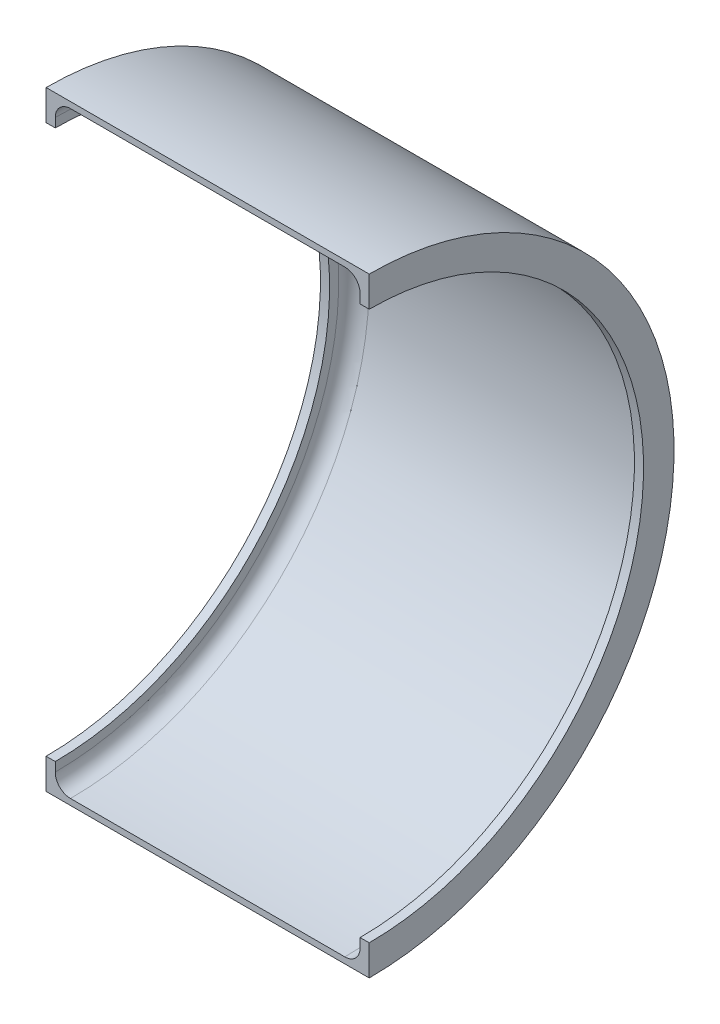
ISO-10303-21;
HEADER;
FILE_DESCRIPTION(('STEP AP214'),'2;1');
FILE_NAME('part.step','',(''),(''),'','','');
FILE_SCHEMA(('AUTOMOTIVE_DESIGN { 1 0 10303 214 1 1 1 1 }'));
ENDSEC;
DATA;
#1=APPLICATION_CONTEXT('core data for automotive mechanical design processes');
#2=APPLICATION_PROTOCOL_DEFINITION('international standard','automotive_design',2000,#1);
#3=PRODUCT_CONTEXT('',#1,'mechanical');
#4=PRODUCT('Part','Part','',(#3));
#5=PRODUCT_RELATED_PRODUCT_CATEGORY('part','',(#4));
#6=PRODUCT_DEFINITION_FORMATION('','',#4);
#7=PRODUCT_DEFINITION_CONTEXT('part definition',#1,'design');
#8=PRODUCT_DEFINITION('design','',#6,#7);
#9=PRODUCT_DEFINITION_SHAPE('','',#8);
#10=(LENGTH_UNIT() NAMED_UNIT(*) SI_UNIT(.MILLI.,.METRE.));
#11=(NAMED_UNIT(*) PLANE_ANGLE_UNIT() SI_UNIT($,.RADIAN.));
#12=(NAMED_UNIT(*) SI_UNIT($,.STERADIAN.) SOLID_ANGLE_UNIT());
#13=UNCERTAINTY_MEASURE_WITH_UNIT(LENGTH_MEASURE(1.E-05),#10,'distance_accuracy_value','');
#14=(GEOMETRIC_REPRESENTATION_CONTEXT(3) GLOBAL_UNCERTAINTY_ASSIGNED_CONTEXT((#13)) GLOBAL_UNIT_ASSIGNED_CONTEXT((#10,
#11,#12)) REPRESENTATION_CONTEXT('',''));
#15=CARTESIAN_POINT('',(0.,0.,0.));
#16=DIRECTION('',(0.,0.,1.));
#17=DIRECTION('',(1.,0.,0.));
#18=AXIS2_PLACEMENT_3D('',#15,#16,#17);
#19=CARTESIAN_POINT('',(-50.,0.,0.));
#20=DIRECTION('',(1.,0.,0.));
#21=DIRECTION('',(0.,0.,-1.));
#22=AXIS2_PLACEMENT_3D('',#19,#20,#21);
#23=CYLINDRICAL_SURFACE('',#22,100.);
#24=DIRECTION('',(-1.,0.,0.));
#25=VECTOR('',#24,1.);
#26=CARTESIAN_POINT('',(-50.,-100.,6.98296267768627E-13));
#27=LINE('',#26,#25);
#28=CARTESIAN_POINT('',(53.,-100.,6.98296267768627E-13));
#29=VERTEX_POINT('',#28);
#30=CARTESIAN_POINT('',(-53.,-100.,6.98296267768627E-13));
#31=VERTEX_POINT('',#30);
#32=EDGE_CURVE('E170',#29,#31,#27,.T.);
#33=ORIENTED_EDGE('',*,*,#32,.T.);
#34=CARTESIAN_POINT('',(-53.,0.,0.));
#35=DIRECTION('',(1.,0.,0.));
#36=DIRECTION('',(0.,0.,-1.));
#37=AXIS2_PLACEMENT_3D('',#34,#35,#36);
#38=CIRCLE('',#37,100.);
#39=CARTESIAN_POINT('',(-53.,100.,0.));
#40=VERTEX_POINT('',#39);
#41=EDGE_CURVE('E141',#31,#40,#38,.T.);
#42=ORIENTED_EDGE('',*,*,#41,.T.);
#43=DIRECTION('',(-1.,0.,0.));
#44=VECTOR('',#43,1.);
#45=CARTESIAN_POINT('',(-50.,100.,0.));
#46=LINE('',#45,#44);
#47=CARTESIAN_POINT('',(53.,100.,0.));
#48=VERTEX_POINT('',#47);
#49=EDGE_CURVE('E166',#48,#40,#46,.T.);
#50=ORIENTED_EDGE('',*,*,#49,.F.);
#51=CARTESIAN_POINT('',(53.,0.,0.));
#52=DIRECTION('',(1.,0.,0.));
#53=DIRECTION('',(0.,0.,-1.));
#54=AXIS2_PLACEMENT_3D('',#51,#52,#53);
#55=CIRCLE('',#54,100.);
#56=EDGE_CURVE('E158',#29,#48,#55,.T.);
#57=ORIENTED_EDGE('',*,*,#56,.F.);
#58=EDGE_LOOP('',(#33,#42,#50,#57));
#59=FACE_BOUND('',#58,.T.);
#60=ADVANCED_FACE('F39',(#59),#23,.T.);
#61=CARTESIAN_POINT('',(-50.,0.,0.));
#62=DIRECTION('',(1.,0.,0.));
#63=DIRECTION('',(0.,0.,-1.));
#64=AXIS2_PLACEMENT_3D('',#61,#62,#63);
#65=CYLINDRICAL_SURFACE('',#64,98.);
#66=DIRECTION('',(1.,0.,0.));
#67=VECTOR('',#66,1.);
#68=CARTESIAN_POINT('',(-50.,98.,0.));
#69=LINE('',#68,#67);
#70=CARTESIAN_POINT('',(-45.,98.,0.));
#71=VERTEX_POINT('',#70);
#72=CARTESIAN_POINT('',(45.,98.,0.));
#73=VERTEX_POINT('',#72);
#74=EDGE_CURVE('E168',#71,#73,#69,.T.);
#75=ORIENTED_EDGE('',*,*,#74,.F.);
#76=CARTESIAN_POINT('',(-45.,0.,0.));
#77=DIRECTION('',(1.,0.,0.));
#78=DIRECTION('',(0.,0.,-1.));
#79=AXIS2_PLACEMENT_3D('',#76,#77,#78);
#80=CIRCLE('',#79,98.);
#81=CARTESIAN_POINT('',(-45.,-98.,6.84330342413254E-13));
#82=VERTEX_POINT('',#81);
#83=EDGE_CURVE('E60',#71,#82,#80,.F.);
#84=ORIENTED_EDGE('',*,*,#83,.T.);
#85=DIRECTION('',(1.,0.,0.));
#86=VECTOR('',#85,1.);
#87=CARTESIAN_POINT('',(-50.,-98.,6.84330342413254E-13));
#88=LINE('',#87,#86);
#89=CARTESIAN_POINT('',(45.,-98.,6.84330342413254E-13));
#90=VERTEX_POINT('',#89);
#91=EDGE_CURVE('E172',#82,#90,#88,.T.);
#92=ORIENTED_EDGE('',*,*,#91,.T.);
#93=CARTESIAN_POINT('',(45.,0.,0.));
#94=DIRECTION('',(-1.,0.,0.));
#95=DIRECTION('',(0.,0.,1.));
#96=AXIS2_PLACEMENT_3D('',#93,#94,#95);
#97=CIRCLE('',#96,98.);
#98=EDGE_CURVE('E174',#90,#73,#97,.F.);
#99=ORIENTED_EDGE('',*,*,#98,.T.);
#100=EDGE_LOOP('',(#75,#84,#92,#99));
#101=FACE_BOUND('',#100,.T.);
#102=ADVANCED_FACE('F196',(#101),#65,.F.);
#103=CARTESIAN_POINT('',(0.,0.,0.));
#104=DIRECTION('',(0.,0.,-1.));
#105=DIRECTION('',(1.,0.,0.));
#106=AXIS2_PLACEMENT_3D('',#103,#104,#105);
#107=PLANE('',#106);
#108=ORIENTED_EDGE('',*,*,#32,.F.);
#109=DIRECTION('',(0.,-1.,0.));
#110=VECTOR('',#109,1.);
#111=CARTESIAN_POINT('',(53.,-100.,6.98296267768627E-13));
#112=LINE('',#111,#110);
#113=CARTESIAN_POINT('',(53.,-90.,6.28466640991764E-13));
#114=VERTEX_POINT('',#113);
#115=EDGE_CURVE('E155',#114,#29,#112,.T.);
#116=ORIENTED_EDGE('',*,*,#115,.F.);
#117=DIRECTION('',(1.,0.,0.));
#118=VECTOR('',#117,1.);
#119=CARTESIAN_POINT('',(50.,-90.,6.28466640991764E-13));
#120=LINE('',#119,#118);
#121=CARTESIAN_POINT('',(50.,-90.,6.28466640991764E-13));
#122=VERTEX_POINT('',#121);
#123=EDGE_CURVE('E152',#122,#114,#120,.T.);
#124=ORIENTED_EDGE('',*,*,#123,.F.);
#125=DIRECTION('',(0.,1.,0.));
#126=VECTOR('',#125,1.);
#127=CARTESIAN_POINT('',(50.,-100.,6.98296267768627E-13));
#128=LINE('',#127,#126);
#129=CARTESIAN_POINT('',(50.,-93.,6.49415529024823E-13));
#130=VERTEX_POINT('',#129);
#131=EDGE_CURVE('E150',#130,#122,#128,.T.);
#132=ORIENTED_EDGE('',*,*,#131,.F.);
#133=CARTESIAN_POINT('',(45.,-93.,6.49415529024823E-13));
#134=DIRECTION('',(0.,0.,-1.));
#135=DIRECTION('',(0.,1.,0.));
#136=AXIS2_PLACEMENT_3D('',#133,#134,#135);
#137=CIRCLE('',#136,5.);
#138=EDGE_CURVE('E181',#130,#90,#137,.T.);
#139=ORIENTED_EDGE('',*,*,#138,.T.);
#140=ORIENTED_EDGE('',*,*,#91,.F.);
#141=CARTESIAN_POINT('',(-45.,-93.,6.49415529024823E-13));
#142=DIRECTION('',(0.,0.,-1.));
#143=DIRECTION('',(0.,1.,0.));
#144=AXIS2_PLACEMENT_3D('',#141,#142,#143);
#145=CIRCLE('',#144,5.);
#146=CARTESIAN_POINT('',(-50.,-93.,6.49415529024823E-13));
#147=VERTEX_POINT('',#146);
#148=EDGE_CURVE('E11',#82,#147,#145,.T.);
#149=ORIENTED_EDGE('',*,*,#148,.T.);
#150=DIRECTION('',(0.,1.,0.));
#151=VECTOR('',#150,1.);
#152=CARTESIAN_POINT('',(-50.,-100.,6.98296267768627E-13));
#153=LINE('',#152,#151);
#154=CARTESIAN_POINT('',(-50.,-90.,6.28466640991764E-13));
#155=VERTEX_POINT('',#154);
#156=EDGE_CURVE('E198',#147,#155,#153,.T.);
#157=ORIENTED_EDGE('',*,*,#156,.T.);
#158=DIRECTION('',(-1.,0.,0.));
#159=VECTOR('',#158,1.);
#160=CARTESIAN_POINT('',(-50.,-90.,6.28466640991764E-13));
#161=LINE('',#160,#159);
#162=CARTESIAN_POINT('',(-53.,-90.,6.28466640991764E-13));
#163=VERTEX_POINT('',#162);
#164=EDGE_CURVE('E135',#155,#163,#161,.T.);
#165=ORIENTED_EDGE('',*,*,#164,.T.);
#166=DIRECTION('',(0.,-1.,0.));
#167=VECTOR('',#166,1.);
#168=CARTESIAN_POINT('',(-53.,-100.,6.98296267768627E-13));
#169=LINE('',#168,#167);
#170=EDGE_CURVE('E200',#163,#31,#169,.T.);
#171=ORIENTED_EDGE('',*,*,#170,.T.);
#172=EDGE_LOOP('',(#108,#116,#124,#132,#139,#140,#149,#157,#165,#171));
#173=FACE_BOUND('',#172,.T.);
#174=ADVANCED_FACE('F189',(#173),#107,.F.);
#175=CARTESIAN_POINT('',(0.,0.,0.));
#176=DIRECTION('',(0.,0.,1.));
#177=DIRECTION('',(1.,0.,0.));
#178=AXIS2_PLACEMENT_3D('',#175,#176,#177);
#179=PLANE('',#178);
#180=DIRECTION('',(0.,-1.,0.));
#181=VECTOR('',#180,1.);
#182=CARTESIAN_POINT('',(-50.,100.,0.));
#183=LINE('',#182,#181);
#184=CARTESIAN_POINT('',(-50.,93.,0.));
#185=VERTEX_POINT('',#184);
#186=CARTESIAN_POINT('',(-50.,90.,0.));
#187=VERTEX_POINT('',#186);
#188=EDGE_CURVE('E114',#185,#187,#183,.T.);
#189=ORIENTED_EDGE('',*,*,#188,.F.);
#190=CARTESIAN_POINT('',(-45.,93.,0.));
#191=DIRECTION('',(0.,0.,1.));
#192=DIRECTION('',(1.,0.,0.));
#193=AXIS2_PLACEMENT_3D('',#190,#191,#192);
#194=CIRCLE('',#193,5.);
#195=EDGE_CURVE('E47',#185,#71,#194,.F.);
#196=ORIENTED_EDGE('',*,*,#195,.T.);
#197=ORIENTED_EDGE('',*,*,#74,.T.);
#198=CARTESIAN_POINT('',(45.,93.,0.));
#199=DIRECTION('',(0.,0.,1.));
#200=DIRECTION('',(1.,0.,0.));
#201=AXIS2_PLACEMENT_3D('',#198,#199,#200);
#202=CIRCLE('',#201,5.);
#203=CARTESIAN_POINT('',(50.,93.,0.));
#204=VERTEX_POINT('',#203);
#205=EDGE_CURVE('E179',#73,#204,#202,.F.);
#206=ORIENTED_EDGE('',*,*,#205,.T.);
#207=DIRECTION('',(0.,-1.,0.));
#208=VECTOR('',#207,1.);
#209=CARTESIAN_POINT('',(50.,100.,0.));
#210=LINE('',#209,#208);
#211=CARTESIAN_POINT('',(50.,90.,0.));
#212=VERTEX_POINT('',#211);
#213=EDGE_CURVE('E136',#204,#212,#210,.T.);
#214=ORIENTED_EDGE('',*,*,#213,.T.);
#215=DIRECTION('',(1.,0.,0.));
#216=VECTOR('',#215,1.);
#217=CARTESIAN_POINT('',(50.,90.,0.));
#218=LINE('',#217,#216);
#219=CARTESIAN_POINT('',(53.,90.,0.));
#220=VERTEX_POINT('',#219);
#221=EDGE_CURVE('E139',#212,#220,#218,.T.);
#222=ORIENTED_EDGE('',*,*,#221,.T.);
#223=DIRECTION('',(0.,1.,0.));
#224=VECTOR('',#223,1.);
#225=CARTESIAN_POINT('',(53.,100.,0.));
#226=LINE('',#225,#224);
#227=EDGE_CURVE('E147',#220,#48,#226,.T.);
#228=ORIENTED_EDGE('',*,*,#227,.T.);
#229=ORIENTED_EDGE('',*,*,#49,.T.);
#230=DIRECTION('',(0.,1.,0.));
#231=VECTOR('',#230,1.);
#232=CARTESIAN_POINT('',(-53.,100.,0.));
#233=LINE('',#232,#231);
#234=CARTESIAN_POINT('',(-53.,90.,0.));
#235=VERTEX_POINT('',#234);
#236=EDGE_CURVE('E127',#235,#40,#233,.T.);
#237=ORIENTED_EDGE('',*,*,#236,.F.);
#238=DIRECTION('',(-1.,0.,0.));
#239=VECTOR('',#238,1.);
#240=CARTESIAN_POINT('',(-50.,90.,0.));
#241=LINE('',#240,#239);
#242=EDGE_CURVE('E122',#187,#235,#241,.T.);
#243=ORIENTED_EDGE('',*,*,#242,.F.);
#244=EDGE_LOOP('',(#189,#196,#197,#206,#214,#222,#228,#229,#237,#243));
#245=FACE_BOUND('',#244,.T.);
#246=ADVANCED_FACE('F125',(#245),#179,.T.);
#247=CARTESIAN_POINT('',(50.,-100.,6.98296267768627E-13));
#248=DIRECTION('',(-1.,0.,0.));
#249=DIRECTION('',(0.,0.,1.));
#250=AXIS2_PLACEMENT_3D('',#247,#248,#249);
#251=PLANE('',#250);
#252=ORIENTED_EDGE('',*,*,#213,.F.);
#253=CARTESIAN_POINT('',(50.,0.,0.));
#254=DIRECTION('',(-1.,0.,0.));
#255=DIRECTION('',(0.,0.,1.));
#256=AXIS2_PLACEMENT_3D('',#253,#254,#255);
#257=CIRCLE('',#256,93.);
#258=EDGE_CURVE('E177',#204,#130,#257,.T.);
#259=ORIENTED_EDGE('',*,*,#258,.T.);
#260=ORIENTED_EDGE('',*,*,#131,.T.);
#261=CARTESIAN_POINT('',(50.,0.,0.));
#262=DIRECTION('',(1.,0.,0.));
#263=DIRECTION('',(0.,0.,-1.));
#264=AXIS2_PLACEMENT_3D('',#261,#262,#263);
#265=CIRCLE('',#264,90.);
#266=EDGE_CURVE('E163',#122,#212,#265,.T.);
#267=ORIENTED_EDGE('',*,*,#266,.T.);
#268=EDGE_LOOP('',(#252,#259,#260,#267));
#269=FACE_BOUND('',#268,.T.);
#270=ADVANCED_FACE('F221',(#269),#251,.T.);
#271=CARTESIAN_POINT('',(-50.,0.,0.));
#272=DIRECTION('',(1.,0.,0.));
#273=DIRECTION('',(0.,0.,-1.));
#274=AXIS2_PLACEMENT_3D('',#271,#272,#273);
#275=CYLINDRICAL_SURFACE('',#274,90.);
#276=CARTESIAN_POINT('',(53.,0.,0.));
#277=DIRECTION('',(1.,0.,0.));
#278=DIRECTION('',(0.,0.,-1.));
#279=AXIS2_PLACEMENT_3D('',#276,#277,#278);
#280=CIRCLE('',#279,90.);
#281=EDGE_CURVE('E161',#114,#220,#280,.T.);
#282=ORIENTED_EDGE('',*,*,#281,.T.);
#283=ORIENTED_EDGE('',*,*,#221,.F.);
#284=ORIENTED_EDGE('',*,*,#266,.F.);
#285=ORIENTED_EDGE('',*,*,#123,.T.);
#286=EDGE_LOOP('',(#282,#283,#284,#285));
#287=FACE_BOUND('',#286,.T.);
#288=ADVANCED_FACE('F218',(#287),#275,.F.);
#289=CARTESIAN_POINT('',(53.,-100.,6.98296267768627E-13));
#290=DIRECTION('',(1.,0.,0.));
#291=DIRECTION('',(0.,0.,-1.));
#292=AXIS2_PLACEMENT_3D('',#289,#290,#291);
#293=PLANE('',#292);
#294=ORIENTED_EDGE('',*,*,#56,.T.);
#295=ORIENTED_EDGE('',*,*,#227,.F.);
#296=ORIENTED_EDGE('',*,*,#281,.F.);
#297=ORIENTED_EDGE('',*,*,#115,.T.);
#298=EDGE_LOOP('',(#294,#295,#296,#297));
#299=FACE_BOUND('',#298,.T.);
#300=ADVANCED_FACE('F214',(#299),#293,.T.);
#301=CARTESIAN_POINT('',(45.,0.,0.));
#302=DIRECTION('',(-1.,0.,0.));
#303=DIRECTION('',(0.,0.,1.));
#304=AXIS2_PLACEMENT_3D('',#301,#302,#303);
#305=TOROIDAL_SURFACE('',#304,93.,5.);
#306=ORIENTED_EDGE('',*,*,#138,.F.);
#307=ORIENTED_EDGE('',*,*,#258,.F.);
#308=ORIENTED_EDGE('',*,*,#205,.F.);
#309=ORIENTED_EDGE('',*,*,#98,.F.);
#310=EDGE_LOOP('',(#306,#307,#308,#309));
#311=FACE_BOUND('',#310,.T.);
#312=ADVANCED_FACE('F195',(#311),#305,.F.);
#313=CARTESIAN_POINT('',(-50.,-100.,6.98296267768627E-13));
#314=DIRECTION('',(1.,0.,0.));
#315=DIRECTION('',(0.,0.,1.));
#316=AXIS2_PLACEMENT_3D('',#313,#314,#315);
#317=PLANE('',#316);
#318=ORIENTED_EDGE('',*,*,#156,.F.);
#319=CARTESIAN_POINT('',(-50.,0.,0.));
#320=DIRECTION('',(1.,0.,0.));
#321=DIRECTION('',(0.,0.,-1.));
#322=AXIS2_PLACEMENT_3D('',#319,#320,#321);
#323=CIRCLE('',#322,93.);
#324=EDGE_CURVE('E121',#147,#185,#323,.T.);
#325=ORIENTED_EDGE('',*,*,#324,.T.);
#326=ORIENTED_EDGE('',*,*,#188,.T.);
#327=CARTESIAN_POINT('',(-50.,0.,0.));
#328=DIRECTION('',(1.,0.,0.));
#329=DIRECTION('',(0.,0.,-1.));
#330=AXIS2_PLACEMENT_3D('',#327,#328,#329);
#331=CIRCLE('',#330,90.);
#332=EDGE_CURVE('E119',#155,#187,#331,.T.);
#333=ORIENTED_EDGE('',*,*,#332,.F.);
#334=EDGE_LOOP('',(#318,#325,#326,#333));
#335=FACE_BOUND('',#334,.T.);
#336=ADVANCED_FACE('F117',(#335),#317,.T.);
#337=CARTESIAN_POINT('',(50.,0.,0.));
#338=DIRECTION('',(-1.,0.,0.));
#339=DIRECTION('',(0.,0.,-1.));
#340=AXIS2_PLACEMENT_3D('',#337,#338,#339);
#341=CYLINDRICAL_SURFACE('',#340,90.);
#342=CARTESIAN_POINT('',(-53.,0.,0.));
#343=DIRECTION('',(1.,0.,0.));
#344=DIRECTION('',(0.,0.,-1.));
#345=AXIS2_PLACEMENT_3D('',#342,#343,#344);
#346=CIRCLE('',#345,90.);
#347=EDGE_CURVE('E137',#163,#235,#346,.T.);
#348=ORIENTED_EDGE('',*,*,#347,.F.);
#349=ORIENTED_EDGE('',*,*,#164,.F.);
#350=ORIENTED_EDGE('',*,*,#332,.T.);
#351=ORIENTED_EDGE('',*,*,#242,.T.);
#352=EDGE_LOOP('',(#348,#349,#350,#351));
#353=FACE_BOUND('',#352,.T.);
#354=ADVANCED_FACE('F133',(#353),#341,.F.);
#355=CARTESIAN_POINT('',(-53.,-100.,6.98296267768627E-13));
#356=DIRECTION('',(-1.,0.,0.));
#357=DIRECTION('',(0.,0.,-1.));
#358=AXIS2_PLACEMENT_3D('',#355,#356,#357);
#359=PLANE('',#358);
#360=ORIENTED_EDGE('',*,*,#41,.F.);
#361=ORIENTED_EDGE('',*,*,#170,.F.);
#362=ORIENTED_EDGE('',*,*,#347,.T.);
#363=ORIENTED_EDGE('',*,*,#236,.T.);
#364=EDGE_LOOP('',(#360,#361,#362,#363));
#365=FACE_BOUND('',#364,.T.);
#366=ADVANCED_FACE('F210',(#365),#359,.T.);
#367=CARTESIAN_POINT('',(-45.,0.,0.));
#368=DIRECTION('',(1.,0.,0.));
#369=DIRECTION('',(0.,0.,-1.));
#370=AXIS2_PLACEMENT_3D('',#367,#368,#369);
#371=TOROIDAL_SURFACE('',#370,93.,5.);
#372=ORIENTED_EDGE('',*,*,#148,.F.);
#373=ORIENTED_EDGE('',*,*,#83,.F.);
#374=ORIENTED_EDGE('',*,*,#195,.F.);
#375=ORIENTED_EDGE('',*,*,#324,.F.);
#376=EDGE_LOOP('',(#372,#373,#374,#375));
#377=FACE_BOUND('',#376,.T.);
#378=ADVANCED_FACE('F41',(#377),#371,.F.);
#379=CLOSED_SHELL('',(#60,#102,#174,#246,#270,#288,#300,#312,#336,#354,#366,#378));
#380=MANIFOLD_SOLID_BREP('B2',#379);
#381=ADVANCED_BREP_SHAPE_REPRESENTATION('',(#18,#380),#14);
#382=SHAPE_DEFINITION_REPRESENTATION(#9,#381);
ENDSEC;
END-ISO-10303-21;
